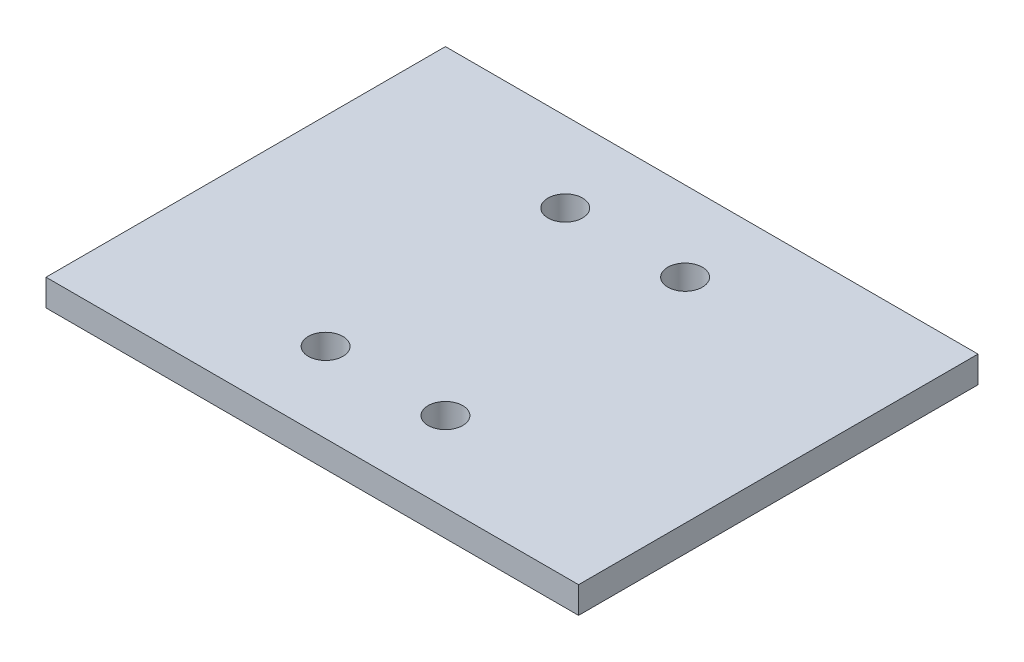
ISO-10303-21;
HEADER;
FILE_DESCRIPTION(('STEP AP214'),'2;1');
FILE_NAME('part.step','',(''),(''),'','','');
FILE_SCHEMA(('AUTOMOTIVE_DESIGN { 1 0 10303 214 1 1 1 1 }'));
ENDSEC;
DATA;
#1=APPLICATION_CONTEXT('core data for automotive mechanical design processes');
#2=APPLICATION_PROTOCOL_DEFINITION('international standard','automotive_design',2000,#1);
#3=PRODUCT_CONTEXT('',#1,'mechanical');
#4=PRODUCT('Part','Part','',(#3));
#5=PRODUCT_RELATED_PRODUCT_CATEGORY('part','',(#4));
#6=PRODUCT_DEFINITION_FORMATION('','',#4);
#7=PRODUCT_DEFINITION_CONTEXT('part definition',#1,'design');
#8=PRODUCT_DEFINITION('design','',#6,#7);
#9=PRODUCT_DEFINITION_SHAPE('','',#8);
#10=(LENGTH_UNIT() NAMED_UNIT(*) SI_UNIT(.MILLI.,.METRE.));
#11=(NAMED_UNIT(*) PLANE_ANGLE_UNIT() SI_UNIT($,.RADIAN.));
#12=(NAMED_UNIT(*) SI_UNIT($,.STERADIAN.) SOLID_ANGLE_UNIT());
#13=UNCERTAINTY_MEASURE_WITH_UNIT(LENGTH_MEASURE(1.E-05),#10,'distance_accuracy_value','');
#14=(GEOMETRIC_REPRESENTATION_CONTEXT(3) GLOBAL_UNCERTAINTY_ASSIGNED_CONTEXT((#13)) GLOBAL_UNIT_ASSIGNED_CONTEXT((#10,
#11,#12)) REPRESENTATION_CONTEXT('',''));
#15=CARTESIAN_POINT('',(0.,0.,0.));
#16=DIRECTION('',(0.,0.,1.));
#17=DIRECTION('',(1.,0.,0.));
#18=AXIS2_PLACEMENT_3D('',#15,#16,#17);
#19=CARTESIAN_POINT('',(0.,2.,0.));
#20=DIRECTION('',(0.,1.,0.));
#21=DIRECTION('',(0.,0.,1.));
#22=AXIS2_PLACEMENT_3D('',#19,#20,#21);
#23=PLANE('',#22);
#24=CARTESIAN_POINT('',(0.,2.,18.));
#25=DIRECTION('',(0.,1.,0.));
#26=DIRECTION('',(0.,0.,1.));
#27=AXIS2_PLACEMENT_3D('',#24,#25,#26);
#28=CIRCLE('',#27,1.3);
#29=CARTESIAN_POINT('',(0.,2.,19.3));
#30=VERTEX_POINT('',#29);
#31=EDGE_CURVE('E121',#30,#30,#28,.T.);
#32=ORIENTED_EDGE('',*,*,#31,.F.);
#33=EDGE_LOOP('',(#32));
#34=FACE_BOUND('',#33,.T.);
#35=CARTESIAN_POINT('',(0.,2.,0.));
#36=DIRECTION('',(0.,1.,0.));
#37=DIRECTION('',(0.,0.,1.));
#38=AXIS2_PLACEMENT_3D('',#35,#36,#37);
#39=CIRCLE('',#38,1.3);
#40=CARTESIAN_POINT('',(0.,2.,1.3));
#41=VERTEX_POINT('',#40);
#42=EDGE_CURVE('E100',#41,#41,#39,.T.);
#43=ORIENTED_EDGE('',*,*,#42,.F.);
#44=EDGE_LOOP('',(#43));
#45=FACE_BOUND('',#44,.T.);
#46=DIRECTION('',(0.,0.,1.));
#47=VECTOR('',#46,1.);
#48=CARTESIAN_POINT('',(-15.,2.,-6.));
#49=LINE('',#48,#47);
#50=CARTESIAN_POINT('',(-15.,2.,-6.));
#51=VERTEX_POINT('',#50);
#52=CARTESIAN_POINT('',(-15.,2.,24.));
#53=VERTEX_POINT('',#52);
#54=EDGE_CURVE('E85',#51,#53,#49,.T.);
#55=ORIENTED_EDGE('',*,*,#54,.T.);
#56=DIRECTION('',(1.,0.,0.));
#57=VECTOR('',#56,1.);
#58=CARTESIAN_POINT('',(-15.,2.,24.));
#59=LINE('',#58,#57);
#60=CARTESIAN_POINT('',(25.,2.,24.));
#61=VERTEX_POINT('',#60);
#62=EDGE_CURVE('E80',#53,#61,#59,.T.);
#63=ORIENTED_EDGE('',*,*,#62,.T.);
#64=DIRECTION('',(0.,0.,-1.));
#65=VECTOR('',#64,1.);
#66=CARTESIAN_POINT('',(25.,2.,-6.));
#67=LINE('',#66,#65);
#68=CARTESIAN_POINT('',(25.,2.,-6.));
#69=VERTEX_POINT('',#68);
#70=EDGE_CURVE('E83',#61,#69,#67,.T.);
#71=ORIENTED_EDGE('',*,*,#70,.T.);
#72=DIRECTION('',(-1.,0.,0.));
#73=VECTOR('',#72,1.);
#74=CARTESIAN_POINT('',(-15.,2.,-6.));
#75=LINE('',#74,#73);
#76=EDGE_CURVE('E50',#69,#51,#75,.T.);
#77=ORIENTED_EDGE('',*,*,#76,.T.);
#78=EDGE_LOOP('',(#55,#63,#71,#77));
#79=FACE_BOUND('',#78,.T.);
#80=CARTESIAN_POINT('',(9.,2.,0.));
#81=DIRECTION('',(0.,1.,0.));
#82=DIRECTION('',(0.,0.,1.));
#83=AXIS2_PLACEMENT_3D('',#80,#81,#82);
#84=CIRCLE('',#83,1.3);
#85=CARTESIAN_POINT('',(9.,2.,1.3));
#86=VERTEX_POINT('',#85);
#87=EDGE_CURVE('E115',#86,#86,#84,.T.);
#88=ORIENTED_EDGE('',*,*,#87,.F.);
#89=EDGE_LOOP('',(#88));
#90=FACE_BOUND('',#89,.T.);
#91=CARTESIAN_POINT('',(9.,2.,18.));
#92=DIRECTION('',(0.,1.,0.));
#93=DIRECTION('',(0.,0.,1.));
#94=AXIS2_PLACEMENT_3D('',#91,#92,#93);
#95=CIRCLE('',#94,1.3);
#96=CARTESIAN_POINT('',(9.,2.,19.3));
#97=VERTEX_POINT('',#96);
#98=EDGE_CURVE('E127',#97,#97,#95,.T.);
#99=ORIENTED_EDGE('',*,*,#98,.F.);
#100=EDGE_LOOP('',(#99));
#101=FACE_BOUND('',#100,.T.);
#102=ADVANCED_FACE('F33',(#34,#45,#79,#90,#101),#23,.T.);
#103=CARTESIAN_POINT('',(0.,0.,0.));
#104=DIRECTION('',(0.,1.,0.));
#105=DIRECTION('',(0.,0.,1.));
#106=AXIS2_PLACEMENT_3D('',#103,#104,#105);
#107=PLANE('',#106);
#108=DIRECTION('',(0.,0.,1.));
#109=VECTOR('',#108,1.);
#110=CARTESIAN_POINT('',(-15.,0.,-6.));
#111=LINE('',#110,#109);
#112=CARTESIAN_POINT('',(-15.,0.,-6.));
#113=VERTEX_POINT('',#112);
#114=CARTESIAN_POINT('',(-15.,0.,24.));
#115=VERTEX_POINT('',#114);
#116=EDGE_CURVE('E97',#113,#115,#111,.T.);
#117=ORIENTED_EDGE('',*,*,#116,.F.);
#118=DIRECTION('',(-1.,0.,0.));
#119=VECTOR('',#118,1.);
#120=CARTESIAN_POINT('',(-15.,0.,-6.));
#121=LINE('',#120,#119);
#122=CARTESIAN_POINT('',(25.,0.,-6.));
#123=VERTEX_POINT('',#122);
#124=EDGE_CURVE('E73',#123,#113,#121,.T.);
#125=ORIENTED_EDGE('',*,*,#124,.F.);
#126=DIRECTION('',(0.,0.,-1.));
#127=VECTOR('',#126,1.);
#128=CARTESIAN_POINT('',(25.,0.,-6.));
#129=LINE('',#128,#127);
#130=CARTESIAN_POINT('',(25.,0.,24.));
#131=VERTEX_POINT('',#130);
#132=EDGE_CURVE('E67',#131,#123,#129,.T.);
#133=ORIENTED_EDGE('',*,*,#132,.F.);
#134=DIRECTION('',(1.,0.,0.));
#135=VECTOR('',#134,1.);
#136=CARTESIAN_POINT('',(-15.,0.,24.));
#137=LINE('',#136,#135);
#138=EDGE_CURVE('E89',#115,#131,#137,.T.);
#139=ORIENTED_EDGE('',*,*,#138,.F.);
#140=EDGE_LOOP('',(#117,#125,#133,#139));
#141=FACE_BOUND('',#140,.T.);
#142=CARTESIAN_POINT('',(0.,0.,0.));
#143=DIRECTION('',(0.,1.,0.));
#144=DIRECTION('',(0.,0.,1.));
#145=AXIS2_PLACEMENT_3D('',#142,#143,#144);
#146=CIRCLE('',#145,1.3);
#147=CARTESIAN_POINT('',(0.,0.,1.3));
#148=VERTEX_POINT('',#147);
#149=EDGE_CURVE('E112',#148,#148,#146,.T.);
#150=ORIENTED_EDGE('',*,*,#149,.T.);
#151=EDGE_LOOP('',(#150));
#152=FACE_BOUND('',#151,.T.);
#153=CARTESIAN_POINT('',(9.,0.,0.));
#154=DIRECTION('',(0.,1.,0.));
#155=DIRECTION('',(0.,0.,1.));
#156=AXIS2_PLACEMENT_3D('',#153,#154,#155);
#157=CIRCLE('',#156,1.3);
#158=CARTESIAN_POINT('',(9.,0.,1.3));
#159=VERTEX_POINT('',#158);
#160=EDGE_CURVE('E118',#159,#159,#157,.T.);
#161=ORIENTED_EDGE('',*,*,#160,.T.);
#162=EDGE_LOOP('',(#161));
#163=FACE_BOUND('',#162,.T.);
#164=CARTESIAN_POINT('',(0.,0.,18.));
#165=DIRECTION('',(0.,1.,0.));
#166=DIRECTION('',(0.,0.,1.));
#167=AXIS2_PLACEMENT_3D('',#164,#165,#166);
#168=CIRCLE('',#167,1.3);
#169=CARTESIAN_POINT('',(0.,0.,19.3));
#170=VERTEX_POINT('',#169);
#171=EDGE_CURVE('E124',#170,#170,#168,.T.);
#172=ORIENTED_EDGE('',*,*,#171,.T.);
#173=EDGE_LOOP('',(#172));
#174=FACE_BOUND('',#173,.T.);
#175=CARTESIAN_POINT('',(9.,0.,18.));
#176=DIRECTION('',(0.,1.,0.));
#177=DIRECTION('',(0.,0.,1.));
#178=AXIS2_PLACEMENT_3D('',#175,#176,#177);
#179=CIRCLE('',#178,1.3);
#180=CARTESIAN_POINT('',(9.,0.,19.3));
#181=VERTEX_POINT('',#180);
#182=EDGE_CURVE('E130',#181,#181,#179,.T.);
#183=ORIENTED_EDGE('',*,*,#182,.T.);
#184=EDGE_LOOP('',(#183));
#185=FACE_BOUND('',#184,.T.);
#186=ADVANCED_FACE('F108',(#141,#152,#163,#174,#185),#107,.F.);
#187=CARTESIAN_POINT('',(-15.,2.,-6.));
#188=DIRECTION('',(1.,0.,0.));
#189=DIRECTION('',(0.,0.,-1.));
#190=AXIS2_PLACEMENT_3D('',#187,#188,#189);
#191=PLANE('',#190);
#192=ORIENTED_EDGE('',*,*,#116,.T.);
#193=DIRECTION('',(0.,-1.,0.));
#194=VECTOR('',#193,1.);
#195=CARTESIAN_POINT('',(-15.,2.,24.));
#196=LINE('',#195,#194);
#197=EDGE_CURVE('E11',#53,#115,#196,.T.);
#198=ORIENTED_EDGE('',*,*,#197,.F.);
#199=ORIENTED_EDGE('',*,*,#54,.F.);
#200=DIRECTION('',(0.,-1.,0.));
#201=VECTOR('',#200,1.);
#202=CARTESIAN_POINT('',(-15.,2.,-6.));
#203=LINE('',#202,#201);
#204=EDGE_CURVE('E93',#51,#113,#203,.T.);
#205=ORIENTED_EDGE('',*,*,#204,.T.);
#206=EDGE_LOOP('',(#192,#198,#199,#205));
#207=FACE_BOUND('',#206,.T.);
#208=ADVANCED_FACE('F35',(#207),#191,.F.);
#209=CARTESIAN_POINT('',(-15.,2.,24.));
#210=DIRECTION('',(0.,0.,-1.));
#211=DIRECTION('',(-1.,0.,0.));
#212=AXIS2_PLACEMENT_3D('',#209,#210,#211);
#213=PLANE('',#212);
#214=ORIENTED_EDGE('',*,*,#138,.T.);
#215=DIRECTION('',(0.,-1.,0.));
#216=VECTOR('',#215,1.);
#217=CARTESIAN_POINT('',(25.,2.,24.));
#218=LINE('',#217,#216);
#219=EDGE_CURVE('E42',#61,#131,#218,.T.);
#220=ORIENTED_EDGE('',*,*,#219,.F.);
#221=ORIENTED_EDGE('',*,*,#62,.F.);
#222=ORIENTED_EDGE('',*,*,#197,.T.);
#223=EDGE_LOOP('',(#214,#220,#221,#222));
#224=FACE_BOUND('',#223,.T.);
#225=ADVANCED_FACE('F88',(#224),#213,.F.);
#226=CARTESIAN_POINT('',(25.,2.,-6.));
#227=DIRECTION('',(-1.,0.,0.));
#228=DIRECTION('',(0.,0.,1.));
#229=AXIS2_PLACEMENT_3D('',#226,#227,#228);
#230=PLANE('',#229);
#231=ORIENTED_EDGE('',*,*,#132,.T.);
#232=DIRECTION('',(0.,-1.,0.));
#233=VECTOR('',#232,1.);
#234=CARTESIAN_POINT('',(25.,2.,-6.));
#235=LINE('',#234,#233);
#236=EDGE_CURVE('E90',#69,#123,#235,.T.);
#237=ORIENTED_EDGE('',*,*,#236,.F.);
#238=ORIENTED_EDGE('',*,*,#70,.F.);
#239=ORIENTED_EDGE('',*,*,#219,.T.);
#240=EDGE_LOOP('',(#231,#237,#238,#239));
#241=FACE_BOUND('',#240,.T.);
#242=ADVANCED_FACE('F91',(#241),#230,.F.);
#243=CARTESIAN_POINT('',(-15.,2.,-6.));
#244=DIRECTION('',(0.,0.,1.));
#245=DIRECTION('',(1.,0.,0.));
#246=AXIS2_PLACEMENT_3D('',#243,#244,#245);
#247=PLANE('',#246);
#248=ORIENTED_EDGE('',*,*,#124,.T.);
#249=ORIENTED_EDGE('',*,*,#204,.F.);
#250=ORIENTED_EDGE('',*,*,#76,.F.);
#251=ORIENTED_EDGE('',*,*,#236,.T.);
#252=EDGE_LOOP('',(#248,#249,#250,#251));
#253=FACE_BOUND('',#252,.T.);
#254=ADVANCED_FACE('F105',(#253),#247,.F.);
#255=CARTESIAN_POINT('',(0.,2.,0.));
#256=DIRECTION('',(0.,-1.,0.));
#257=DIRECTION('',(0.,0.,-1.));
#258=AXIS2_PLACEMENT_3D('',#255,#256,#257);
#259=CYLINDRICAL_SURFACE('',#258,1.3);
#260=ORIENTED_EDGE('',*,*,#42,.T.);
#261=EDGE_LOOP('',(#260));
#262=FACE_BOUND('',#261,.T.);
#263=ORIENTED_EDGE('',*,*,#149,.F.);
#264=EDGE_LOOP('',(#263));
#265=FACE_BOUND('',#264,.T.);
#266=ADVANCED_FACE('F149',(#262,#265),#259,.F.);
#267=CARTESIAN_POINT('',(9.,2.,0.));
#268=DIRECTION('',(0.,-1.,0.));
#269=DIRECTION('',(0.,0.,-1.));
#270=AXIS2_PLACEMENT_3D('',#267,#268,#269);
#271=CYLINDRICAL_SURFACE('',#270,1.3);
#272=ORIENTED_EDGE('',*,*,#87,.T.);
#273=EDGE_LOOP('',(#272));
#274=FACE_BOUND('',#273,.T.);
#275=ORIENTED_EDGE('',*,*,#160,.F.);
#276=EDGE_LOOP('',(#275));
#277=FACE_BOUND('',#276,.T.);
#278=ADVANCED_FACE('F195',(#274,#277),#271,.F.);
#279=CARTESIAN_POINT('',(0.,2.,18.));
#280=DIRECTION('',(0.,-1.,0.));
#281=DIRECTION('',(0.,0.,-1.));
#282=AXIS2_PLACEMENT_3D('',#279,#280,#281);
#283=CYLINDRICAL_SURFACE('',#282,1.3);
#284=ORIENTED_EDGE('',*,*,#31,.T.);
#285=EDGE_LOOP('',(#284));
#286=FACE_BOUND('',#285,.T.);
#287=ORIENTED_EDGE('',*,*,#171,.F.);
#288=EDGE_LOOP('',(#287));
#289=FACE_BOUND('',#288,.T.);
#290=ADVANCED_FACE('F203',(#286,#289),#283,.F.);
#291=CARTESIAN_POINT('',(9.,2.,18.));
#292=DIRECTION('',(0.,-1.,0.));
#293=DIRECTION('',(0.,0.,-1.));
#294=AXIS2_PLACEMENT_3D('',#291,#292,#293);
#295=CYLINDRICAL_SURFACE('',#294,1.3);
#296=ORIENTED_EDGE('',*,*,#98,.T.);
#297=EDGE_LOOP('',(#296));
#298=FACE_BOUND('',#297,.T.);
#299=ORIENTED_EDGE('',*,*,#182,.F.);
#300=EDGE_LOOP('',(#299));
#301=FACE_BOUND('',#300,.T.);
#302=ADVANCED_FACE('F136',(#298,#301),#295,.F.);
#303=CLOSED_SHELL('',(#102,#186,#208,#225,#242,#254,#266,#278,#290,#302));
#304=MANIFOLD_SOLID_BREP('B2',#303);
#305=ADVANCED_BREP_SHAPE_REPRESENTATION('',(#18,#304),#14);
#306=SHAPE_DEFINITION_REPRESENTATION(#9,#305);
ENDSEC;
END-ISO-10303-21;
